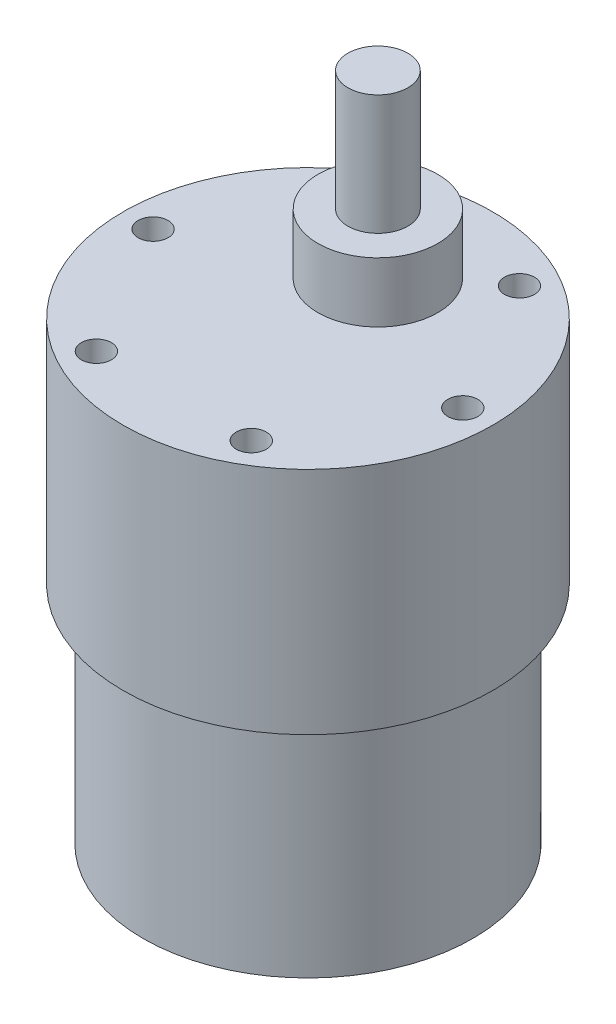
ISO-10303-21;
HEADER;
FILE_DESCRIPTION(('STEP AP214'),'2;1');
FILE_NAME('part.step','',(''),(''),'','','');
FILE_SCHEMA(('AUTOMOTIVE_DESIGN { 1 0 10303 214 1 1 1 1 }'));
ENDSEC;
DATA;
#1=APPLICATION_CONTEXT('core data for automotive mechanical design processes');
#2=APPLICATION_PROTOCOL_DEFINITION('international standard','automotive_design',2000,#1);
#3=PRODUCT_CONTEXT('',#1,'mechanical');
#4=PRODUCT('Part','Part','',(#3));
#5=PRODUCT_RELATED_PRODUCT_CATEGORY('part','',(#4));
#6=PRODUCT_DEFINITION_FORMATION('','',#4);
#7=PRODUCT_DEFINITION_CONTEXT('part definition',#1,'design');
#8=PRODUCT_DEFINITION('design','',#6,#7);
#9=PRODUCT_DEFINITION_SHAPE('','',#8);
#10=(LENGTH_UNIT() NAMED_UNIT(*) SI_UNIT(.MILLI.,.METRE.));
#11=(NAMED_UNIT(*) PLANE_ANGLE_UNIT() SI_UNIT($,.RADIAN.));
#12=(NAMED_UNIT(*) SI_UNIT($,.STERADIAN.) SOLID_ANGLE_UNIT());
#13=UNCERTAINTY_MEASURE_WITH_UNIT(LENGTH_MEASURE(1.E-05),#10,'distance_accuracy_value','');
#14=(GEOMETRIC_REPRESENTATION_CONTEXT(3) GLOBAL_UNCERTAINTY_ASSIGNED_CONTEXT((#13)) GLOBAL_UNIT_ASSIGNED_CONTEXT((#10,
#11,#12)) REPRESENTATION_CONTEXT('',''));
#15=CARTESIAN_POINT('',(0.,0.,0.));
#16=DIRECTION('',(0.,0.,1.));
#17=DIRECTION('',(1.,0.,0.));
#18=AXIS2_PLACEMENT_3D('',#15,#16,#17);
#19=CARTESIAN_POINT('',(0.,6.,-7.));
#20=DIRECTION('',(0.,1.,0.));
#21=DIRECTION('',(0.,0.,1.));
#22=AXIS2_PLACEMENT_3D('',#19,#20,#21);
#23=PLANE('',#22);
#24=CARTESIAN_POINT('',(0.,6.,-7.));
#25=DIRECTION('',(0.,1.,0.));
#26=DIRECTION('',(0.,0.,1.));
#27=AXIS2_PLACEMENT_3D('',#24,#25,#26);
#28=CIRCLE('',#27,6.);
#29=CARTESIAN_POINT('',(0.,6.,-0.999999999999999));
#30=VERTEX_POINT('',#29);
#31=EDGE_CURVE('E89',#30,#30,#28,.T.);
#32=ORIENTED_EDGE('',*,*,#31,.T.);
#33=EDGE_LOOP('',(#32));
#34=FACE_BOUND('',#33,.T.);
#35=CARTESIAN_POINT('',(0.,6.,-7.));
#36=DIRECTION('',(0.,1.,0.));
#37=DIRECTION('',(0.,0.,1.));
#38=AXIS2_PLACEMENT_3D('',#35,#36,#37);
#39=CIRCLE('',#38,3.);
#40=CARTESIAN_POINT('',(0.,6.,-4.));
#41=VERTEX_POINT('',#40);
#42=EDGE_CURVE('E98',#41,#41,#39,.T.);
#43=ORIENTED_EDGE('',*,*,#42,.F.);
#44=EDGE_LOOP('',(#43));
#45=FACE_BOUND('',#44,.T.);
#46=ADVANCED_FACE('F35',(#34,#45),#23,.T.);
#47=CARTESIAN_POINT('',(0.,0.,0.));
#48=DIRECTION('',(0.,1.,0.));
#49=DIRECTION('',(0.,0.,1.));
#50=AXIS2_PLACEMENT_3D('',#47,#48,#49);
#51=PLANE('',#50);
#52=CARTESIAN_POINT('',(0.,0.,0.));
#53=DIRECTION('',(0.,1.,0.));
#54=DIRECTION('',(0.,0.,1.));
#55=AXIS2_PLACEMENT_3D('',#52,#53,#54);
#56=CIRCLE('',#55,18.5);
#57=CARTESIAN_POINT('',(0.,0.,18.5));
#58=VERTEX_POINT('',#57);
#59=EDGE_CURVE('E46',#58,#58,#56,.T.);
#60=ORIENTED_EDGE('',*,*,#59,.T.);
#61=EDGE_LOOP('',(#60));
#62=FACE_BOUND('',#61,.T.);
#63=CARTESIAN_POINT('',(-15.5,0.,0.));
#64=DIRECTION('',(0.,1.,0.));
#65=DIRECTION('',(0.,0.,1.));
#66=AXIS2_PLACEMENT_3D('',#63,#64,#65);
#67=CIRCLE('',#66,1.5);
#68=CARTESIAN_POINT('',(-15.5,0.,1.5));
#69=VERTEX_POINT('',#68);
#70=EDGE_CURVE('E56',#69,#69,#67,.T.);
#71=ORIENTED_EDGE('',*,*,#70,.F.);
#72=EDGE_LOOP('',(#71));
#73=FACE_BOUND('',#72,.T.);
#74=CARTESIAN_POINT('',(-7.74999999999997,0.,-13.4233937586588));
#75=DIRECTION('',(0.,1.,0.));
#76=DIRECTION('',(0.,0.,1.));
#77=AXIS2_PLACEMENT_3D('',#74,#75,#76);
#78=CIRCLE('',#77,1.5);
#79=CARTESIAN_POINT('',(-7.74999999999997,0.,-11.9233937586588));
#80=VERTEX_POINT('',#79);
#81=EDGE_CURVE('E62',#80,#80,#78,.T.);
#82=ORIENTED_EDGE('',*,*,#81,.F.);
#83=EDGE_LOOP('',(#82));
#84=FACE_BOUND('',#83,.T.);
#85=CARTESIAN_POINT('',(7.75000000000006,0.,-13.4233937586588));
#86=DIRECTION('',(0.,1.,0.));
#87=DIRECTION('',(0.,0.,1.));
#88=AXIS2_PLACEMENT_3D('',#85,#86,#87);
#89=CIRCLE('',#88,1.5);
#90=CARTESIAN_POINT('',(7.75000000000006,0.,-11.9233937586588));
#91=VERTEX_POINT('',#90);
#92=EDGE_CURVE('E68',#91,#91,#89,.T.);
#93=ORIENTED_EDGE('',*,*,#92,.F.);
#94=EDGE_LOOP('',(#93));
#95=FACE_BOUND('',#94,.T.);
#96=CARTESIAN_POINT('',(15.5,0.,1.08235921504137E-13));
#97=DIRECTION('',(0.,1.,0.));
#98=DIRECTION('',(0.,0.,1.));
#99=AXIS2_PLACEMENT_3D('',#96,#97,#98);
#100=CIRCLE('',#99,1.5);
#101=CARTESIAN_POINT('',(15.5,0.,1.50000000000011));
#102=VERTEX_POINT('',#101);
#103=EDGE_CURVE('E74',#102,#102,#100,.T.);
#104=ORIENTED_EDGE('',*,*,#103,.F.);
#105=EDGE_LOOP('',(#104));
#106=FACE_BOUND('',#105,.T.);
#107=CARTESIAN_POINT('',(7.74999999999987,0.,13.4233937586589));
#108=DIRECTION('',(0.,1.,0.));
#109=DIRECTION('',(0.,0.,1.));
#110=AXIS2_PLACEMENT_3D('',#107,#108,#109);
#111=CIRCLE('',#110,1.5);
#112=CARTESIAN_POINT('',(7.74999999999987,0.,14.9233937586589));
#113=VERTEX_POINT('',#112);
#114=EDGE_CURVE('E80',#113,#113,#111,.T.);
#115=ORIENTED_EDGE('',*,*,#114,.F.);
#116=EDGE_LOOP('',(#115));
#117=FACE_BOUND('',#116,.T.);
#118=CARTESIAN_POINT('',(-7.75000000000016,0.,13.4233937586587));
#119=DIRECTION('',(0.,1.,0.));
#120=DIRECTION('',(0.,0.,1.));
#121=AXIS2_PLACEMENT_3D('',#118,#119,#120);
#122=CIRCLE('',#121,1.5);
#123=CARTESIAN_POINT('',(-7.75000000000016,0.,14.9233937586587));
#124=VERTEX_POINT('',#123);
#125=EDGE_CURVE('E86',#124,#124,#122,.T.);
#126=ORIENTED_EDGE('',*,*,#125,.F.);
#127=EDGE_LOOP('',(#126));
#128=FACE_BOUND('',#127,.T.);
#129=CARTESIAN_POINT('',(0.,0.,-7.));
#130=DIRECTION('',(0.,1.,0.));
#131=DIRECTION('',(0.,0.,1.));
#132=AXIS2_PLACEMENT_3D('',#129,#130,#131);
#133=CIRCLE('',#132,6.);
#134=CARTESIAN_POINT('',(0.,0.,-0.999999999999999));
#135=VERTEX_POINT('',#134);
#136=EDGE_CURVE('E92',#135,#135,#133,.T.);
#137=ORIENTED_EDGE('',*,*,#136,.F.);
#138=EDGE_LOOP('',(#137));
#139=FACE_BOUND('',#138,.T.);
#140=ADVANCED_FACE('F114',(#62,#73,#84,#95,#106,#117,#128,#139),#51,.T.);
#141=CARTESIAN_POINT('',(0.,-23.,0.));
#142=DIRECTION('',(0.,1.,0.));
#143=DIRECTION('',(0.,0.,1.));
#144=AXIS2_PLACEMENT_3D('',#141,#142,#143);
#145=PLANE('',#144);
#146=CARTESIAN_POINT('',(0.,-23.,0.));
#147=DIRECTION('',(0.,1.,0.));
#148=DIRECTION('',(0.,0.,1.));
#149=AXIS2_PLACEMENT_3D('',#146,#147,#148);
#150=CIRCLE('',#149,18.5);
#151=CARTESIAN_POINT('',(0.,-23.,18.5));
#152=VERTEX_POINT('',#151);
#153=EDGE_CURVE('E42',#152,#152,#150,.T.);
#154=ORIENTED_EDGE('',*,*,#153,.F.);
#155=EDGE_LOOP('',(#154));
#156=FACE_BOUND('',#155,.T.);
#157=CARTESIAN_POINT('',(0.,-23.,0.));
#158=DIRECTION('',(0.,1.,0.));
#159=DIRECTION('',(0.,0.,1.));
#160=AXIS2_PLACEMENT_3D('',#157,#158,#159);
#161=CIRCLE('',#160,16.5);
#162=CARTESIAN_POINT('',(0.,-23.,16.5));
#163=VERTEX_POINT('',#162);
#164=EDGE_CURVE('E10',#163,#163,#161,.F.);
#165=ORIENTED_EDGE('',*,*,#164,.F.);
#166=EDGE_LOOP('',(#165));
#167=FACE_BOUND('',#166,.T.);
#168=ADVANCED_FACE('F120',(#156,#167),#145,.F.);
#169=CARTESIAN_POINT('',(0.,-23.,0.));
#170=DIRECTION('',(0.,1.,0.));
#171=DIRECTION('',(0.,0.,1.));
#172=AXIS2_PLACEMENT_3D('',#169,#170,#171);
#173=CYLINDRICAL_SURFACE('',#172,18.5);
#174=ORIENTED_EDGE('',*,*,#153,.T.);
#175=EDGE_LOOP('',(#174));
#176=FACE_BOUND('',#175,.T.);
#177=ORIENTED_EDGE('',*,*,#59,.F.);
#178=EDGE_LOOP('',(#177));
#179=FACE_BOUND('',#178,.T.);
#180=ADVANCED_FACE('F37',(#176,#179),#173,.T.);
#181=CARTESIAN_POINT('',(0.,-45.5,0.));
#182=DIRECTION('',(0.,1.,0.));
#183=DIRECTION('',(0.,0.,1.));
#184=AXIS2_PLACEMENT_3D('',#181,#182,#183);
#185=CYLINDRICAL_SURFACE('',#184,16.5);
#186=CARTESIAN_POINT('',(0.,-45.5,0.));
#187=DIRECTION('',(0.,-1.,0.));
#188=DIRECTION('',(0.,0.,-1.));
#189=AXIS2_PLACEMENT_3D('',#186,#187,#188);
#190=CIRCLE('',#189,16.5);
#191=CARTESIAN_POINT('',(0.,-45.5,16.5));
#192=VERTEX_POINT('',#191);
#193=EDGE_CURVE('E51',#192,#192,#190,.T.);
#194=CARTESIAN_POINT('',(0.,-45.5,16.5));
#195=CARTESIAN_POINT('',(0.,-45.265625,16.5));
#196=CARTESIAN_POINT('',(0.,-45.03125,16.5));
#197=CARTESIAN_POINT('',(0.,-44.5625,16.5));
#198=CARTESIAN_POINT('',(0.,-44.328125,16.5));
#199=CARTESIAN_POINT('',(0.,-43.859375,16.5));
#200=CARTESIAN_POINT('',(0.,-43.625,16.5));
#201=CARTESIAN_POINT('',(0.,-43.15625,16.5));
#202=CARTESIAN_POINT('',(0.,-42.921875,16.5));
#203=CARTESIAN_POINT('',(0.,-42.453125,16.5));
#204=CARTESIAN_POINT('',(0.,-42.21875,16.5));
#205=CARTESIAN_POINT('',(0.,-41.75,16.5));
#206=CARTESIAN_POINT('',(0.,-41.515625,16.5));
#207=CARTESIAN_POINT('',(0.,-41.046875,16.5));
#208=CARTESIAN_POINT('',(0.,-40.8125,16.5));
#209=CARTESIAN_POINT('',(0.,-40.34375,16.5));
#210=CARTESIAN_POINT('',(0.,-40.109375,16.5));
#211=CARTESIAN_POINT('',(0.,-39.640625,16.5));
#212=CARTESIAN_POINT('',(0.,-39.40625,16.5));
#213=CARTESIAN_POINT('',(0.,-38.9375,16.5));
#214=CARTESIAN_POINT('',(0.,-38.703125,16.5));
#215=CARTESIAN_POINT('',(0.,-38.234375,16.5));
#216=CARTESIAN_POINT('',(0.,-38.,16.5));
#217=CARTESIAN_POINT('',(0.,-37.53125,16.5));
#218=CARTESIAN_POINT('',(0.,-37.296875,16.5));
#219=CARTESIAN_POINT('',(0.,-36.828125,16.5));
#220=CARTESIAN_POINT('',(0.,-36.59375,16.5));
#221=CARTESIAN_POINT('',(0.,-36.125,16.5));
#222=CARTESIAN_POINT('',(0.,-35.890625,16.5));
#223=CARTESIAN_POINT('',(0.,-35.421875,16.5));
#224=CARTESIAN_POINT('',(0.,-35.1875,16.5));
#225=CARTESIAN_POINT('',(0.,-34.71875,16.5));
#226=CARTESIAN_POINT('',(0.,-34.484375,16.5));
#227=CARTESIAN_POINT('',(0.,-34.015625,16.5));
#228=CARTESIAN_POINT('',(0.,-33.78125,16.5));
#229=CARTESIAN_POINT('',(0.,-33.3125,16.5));
#230=CARTESIAN_POINT('',(0.,-33.078125,16.5));
#231=CARTESIAN_POINT('',(0.,-32.609375,16.5));
#232=CARTESIAN_POINT('',(0.,-32.375,16.5));
#233=CARTESIAN_POINT('',(0.,-31.90625,16.5));
#234=CARTESIAN_POINT('',(0.,-31.671875,16.5));
#235=CARTESIAN_POINT('',(0.,-31.203125,16.5));
#236=CARTESIAN_POINT('',(0.,-30.96875,16.5));
#237=CARTESIAN_POINT('',(0.,-30.5,16.5));
#238=CARTESIAN_POINT('',(0.,-30.265625,16.5));
#239=CARTESIAN_POINT('',(0.,-29.796875,16.5));
#240=CARTESIAN_POINT('',(0.,-29.5625,16.5));
#241=CARTESIAN_POINT('',(0.,-29.09375,16.5));
#242=CARTESIAN_POINT('',(0.,-28.859375,16.5));
#243=CARTESIAN_POINT('',(0.,-28.390625,16.5));
#244=CARTESIAN_POINT('',(0.,-28.15625,16.5));
#245=CARTESIAN_POINT('',(0.,-27.6875,16.5));
#246=CARTESIAN_POINT('',(0.,-27.453125,16.5));
#247=CARTESIAN_POINT('',(0.,-26.984375,16.5));
#248=CARTESIAN_POINT('',(0.,-26.75,16.5));
#249=CARTESIAN_POINT('',(0.,-26.28125,16.5));
#250=CARTESIAN_POINT('',(0.,-26.046875,16.5));
#251=CARTESIAN_POINT('',(0.,-25.578125,16.5));
#252=CARTESIAN_POINT('',(0.,-25.34375,16.5));
#253=CARTESIAN_POINT('',(0.,-24.875,16.5));
#254=CARTESIAN_POINT('',(0.,-24.640625,16.5));
#255=CARTESIAN_POINT('',(0.,-24.171875,16.5));
#256=CARTESIAN_POINT('',(0.,-23.9375,16.5));
#257=CARTESIAN_POINT('',(0.,-23.46875,16.5));
#258=CARTESIAN_POINT('',(0.,-23.234375,16.5));
#259=CARTESIAN_POINT('',(0.,-23.,16.5));
#260=B_SPLINE_CURVE_WITH_KNOTS('',3,(#194,#195,#196,#197,#198,#199,#200,#201,#202,#203,#204,
#205,#206,#207,#208,#209,#210,#211,#212,#213,#214,#215,#216,#217,#218,#219,#220,#221,#222,#223,
#224,#225,#226,#227,#228,#229,#230,#231,#232,#233,#234,#235,#236,#237,#238,#239,#240,#241,#242,
#243,#244,#245,#246,#247,#248,#249,#250,#251,#252,#253,#254,#255,#256,#257,#258,#259),
.UNSPECIFIED.,.F.,.F.,(4,2,2,2,2,2,2,2,2,2,2,2,2,2,2,2,2,2,2,2,2,2,2,2,2,2,2,2,2,2,2,2,4),(0.,
0.703125000000006,1.40625,2.109375,2.8125,3.515625,4.21875,4.921875,5.62500000000001,6.328125,
7.03125,7.734375,8.4375,9.140625,9.84375,10.546875,11.25,11.953125,12.65625,13.359375,14.0625,
14.765625,15.46875,16.171875,16.875,17.578125,18.28125,18.984375,19.6875,20.390625,21.09375,
21.796875,22.5),.UNSPECIFIED.);
#261=EDGE_CURVE('BSEAM178',#192,#163,#260,.T.);
#262=ORIENTED_EDGE('',*,*,#193,.F.);
#263=ORIENTED_EDGE('',*,*,#164,.T.);
#264=ORIENTED_EDGE('',*,*,#261,.T.);
#265=ORIENTED_EDGE('',*,*,#261,.F.);
#266=EDGE_LOOP('',(#262,#264,#263,#265));
#267=FACE_BOUND('',#266,.T.);
#268=ADVANCED_FACE('F178',(#267),#185,.T.);
#269=CARTESIAN_POINT('',(0.,-45.5,0.));
#270=DIRECTION('',(0.,-1.,0.));
#271=DIRECTION('',(0.,0.,-1.));
#272=AXIS2_PLACEMENT_3D('',#269,#270,#271);
#273=PLANE('',#272);
#274=ORIENTED_EDGE('',*,*,#193,.T.);
#275=EDGE_LOOP('',(#274));
#276=FACE_BOUND('',#275,.T.);
#277=ADVANCED_FACE('F174',(#276),#273,.T.);
#278=CARTESIAN_POINT('',(-15.5,-10.,0.));
#279=DIRECTION('',(0.,1.,0.));
#280=DIRECTION('',(0.,0.,1.));
#281=AXIS2_PLACEMENT_3D('',#278,#279,#280);
#282=CYLINDRICAL_SURFACE('',#281,1.5);
#283=CARTESIAN_POINT('',(-15.5,-10.,0.));
#284=DIRECTION('',(0.,1.,0.));
#285=DIRECTION('',(0.,0.,1.));
#286=AXIS2_PLACEMENT_3D('',#283,#284,#285);
#287=CIRCLE('',#286,1.5);
#288=CARTESIAN_POINT('',(-15.5,-10.,1.5));
#289=VERTEX_POINT('',#288);
#290=EDGE_CURVE('E55',#289,#289,#287,.T.);
#291=ORIENTED_EDGE('',*,*,#290,.F.);
#292=EDGE_LOOP('',(#291));
#293=FACE_BOUND('',#292,.T.);
#294=ORIENTED_EDGE('',*,*,#70,.T.);
#295=EDGE_LOOP('',(#294));
#296=FACE_BOUND('',#295,.T.);
#297=ADVANCED_FACE('F170',(#293,#296),#282,.F.);
#298=CARTESIAN_POINT('',(-15.5,-10.,0.));
#299=DIRECTION('',(0.,1.,0.));
#300=DIRECTION('',(0.,0.,1.));
#301=AXIS2_PLACEMENT_3D('',#298,#299,#300);
#302=PLANE('',#301);
#303=ORIENTED_EDGE('',*,*,#290,.T.);
#304=EDGE_LOOP('',(#303));
#305=FACE_BOUND('',#304,.T.);
#306=ADVANCED_FACE('F166',(#305),#302,.T.);
#307=CARTESIAN_POINT('',(-7.74999999999997,-10.,-13.4233937586588));
#308=DIRECTION('',(0.,1.,0.));
#309=DIRECTION('',(0.,0.,1.));
#310=AXIS2_PLACEMENT_3D('',#307,#308,#309);
#311=CYLINDRICAL_SURFACE('',#310,1.5);
#312=CARTESIAN_POINT('',(-7.74999999999997,-10.,-13.4233937586588));
#313=DIRECTION('',(0.,1.,0.));
#314=DIRECTION('',(0.,0.,1.));
#315=AXIS2_PLACEMENT_3D('',#312,#313,#314);
#316=CIRCLE('',#315,1.5);
#317=CARTESIAN_POINT('',(-7.74999999999997,-10.,-11.9233937586588));
#318=VERTEX_POINT('',#317);
#319=EDGE_CURVE('E59',#318,#318,#316,.T.);
#320=ORIENTED_EDGE('',*,*,#319,.F.);
#321=EDGE_LOOP('',(#320));
#322=FACE_BOUND('',#321,.T.);
#323=ORIENTED_EDGE('',*,*,#81,.T.);
#324=EDGE_LOOP('',(#323));
#325=FACE_BOUND('',#324,.T.);
#326=ADVANCED_FACE('F162',(#322,#325),#311,.F.);
#327=CARTESIAN_POINT('',(-7.74999999999997,-10.,-13.4233937586588));
#328=DIRECTION('',(0.,1.,0.));
#329=DIRECTION('',(0.,0.,1.));
#330=AXIS2_PLACEMENT_3D('',#327,#328,#329);
#331=PLANE('',#330);
#332=ORIENTED_EDGE('',*,*,#319,.T.);
#333=EDGE_LOOP('',(#332));
#334=FACE_BOUND('',#333,.T.);
#335=ADVANCED_FACE('F158',(#334),#331,.T.);
#336=CARTESIAN_POINT('',(7.75000000000006,-10.,-13.4233937586588));
#337=DIRECTION('',(0.,1.,0.));
#338=DIRECTION('',(0.,0.,1.));
#339=AXIS2_PLACEMENT_3D('',#336,#337,#338);
#340=CYLINDRICAL_SURFACE('',#339,1.5);
#341=CARTESIAN_POINT('',(7.75000000000006,-10.,-13.4233937586588));
#342=DIRECTION('',(0.,1.,0.));
#343=DIRECTION('',(0.,0.,1.));
#344=AXIS2_PLACEMENT_3D('',#341,#342,#343);
#345=CIRCLE('',#344,1.5);
#346=CARTESIAN_POINT('',(7.75000000000006,-10.,-11.9233937586588));
#347=VERTEX_POINT('',#346);
#348=EDGE_CURVE('E65',#347,#347,#345,.T.);
#349=ORIENTED_EDGE('',*,*,#348,.F.);
#350=EDGE_LOOP('',(#349));
#351=FACE_BOUND('',#350,.T.);
#352=ORIENTED_EDGE('',*,*,#92,.T.);
#353=EDGE_LOOP('',(#352));
#354=FACE_BOUND('',#353,.T.);
#355=ADVANCED_FACE('F154',(#351,#354),#340,.F.);
#356=CARTESIAN_POINT('',(7.75000000000006,-10.,-13.4233937586588));
#357=DIRECTION('',(0.,1.,0.));
#358=DIRECTION('',(0.,0.,1.));
#359=AXIS2_PLACEMENT_3D('',#356,#357,#358);
#360=PLANE('',#359);
#361=ORIENTED_EDGE('',*,*,#348,.T.);
#362=EDGE_LOOP('',(#361));
#363=FACE_BOUND('',#362,.T.);
#364=ADVANCED_FACE('F150',(#363),#360,.T.);
#365=CARTESIAN_POINT('',(15.5,-10.,1.08235921504137E-13));
#366=DIRECTION('',(0.,1.,0.));
#367=DIRECTION('',(0.,0.,1.));
#368=AXIS2_PLACEMENT_3D('',#365,#366,#367);
#369=CYLINDRICAL_SURFACE('',#368,1.5);
#370=CARTESIAN_POINT('',(15.5,-10.,1.08235921504137E-13));
#371=DIRECTION('',(0.,1.,0.));
#372=DIRECTION('',(0.,0.,1.));
#373=AXIS2_PLACEMENT_3D('',#370,#371,#372);
#374=CIRCLE('',#373,1.5);
#375=CARTESIAN_POINT('',(15.5,-10.,1.50000000000011));
#376=VERTEX_POINT('',#375);
#377=EDGE_CURVE('E71',#376,#376,#374,.T.);
#378=ORIENTED_EDGE('',*,*,#377,.F.);
#379=EDGE_LOOP('',(#378));
#380=FACE_BOUND('',#379,.T.);
#381=ORIENTED_EDGE('',*,*,#103,.T.);
#382=EDGE_LOOP('',(#381));
#383=FACE_BOUND('',#382,.T.);
#384=ADVANCED_FACE('F146',(#380,#383),#369,.F.);
#385=CARTESIAN_POINT('',(15.5,-10.,1.08235921504137E-13));
#386=DIRECTION('',(0.,1.,0.));
#387=DIRECTION('',(0.,0.,1.));
#388=AXIS2_PLACEMENT_3D('',#385,#386,#387);
#389=PLANE('',#388);
#390=ORIENTED_EDGE('',*,*,#377,.T.);
#391=EDGE_LOOP('',(#390));
#392=FACE_BOUND('',#391,.T.);
#393=ADVANCED_FACE('F142',(#392),#389,.T.);
#394=CARTESIAN_POINT('',(7.74999999999987,-10.,13.4233937586589));
#395=DIRECTION('',(0.,1.,0.));
#396=DIRECTION('',(0.,0.,1.));
#397=AXIS2_PLACEMENT_3D('',#394,#395,#396);
#398=CYLINDRICAL_SURFACE('',#397,1.5);
#399=CARTESIAN_POINT('',(7.74999999999987,-10.,13.4233937586589));
#400=DIRECTION('',(0.,1.,0.));
#401=DIRECTION('',(0.,0.,1.));
#402=AXIS2_PLACEMENT_3D('',#399,#400,#401);
#403=CIRCLE('',#402,1.5);
#404=CARTESIAN_POINT('',(7.74999999999987,-10.,14.9233937586589));
#405=VERTEX_POINT('',#404);
#406=EDGE_CURVE('E77',#405,#405,#403,.T.);
#407=ORIENTED_EDGE('',*,*,#406,.F.);
#408=EDGE_LOOP('',(#407));
#409=FACE_BOUND('',#408,.T.);
#410=ORIENTED_EDGE('',*,*,#114,.T.);
#411=EDGE_LOOP('',(#410));
#412=FACE_BOUND('',#411,.T.);
#413=ADVANCED_FACE('F138',(#409,#412),#398,.F.);
#414=CARTESIAN_POINT('',(7.74999999999987,-10.,13.4233937586589));
#415=DIRECTION('',(0.,1.,0.));
#416=DIRECTION('',(0.,0.,1.));
#417=AXIS2_PLACEMENT_3D('',#414,#415,#416);
#418=PLANE('',#417);
#419=ORIENTED_EDGE('',*,*,#406,.T.);
#420=EDGE_LOOP('',(#419));
#421=FACE_BOUND('',#420,.T.);
#422=ADVANCED_FACE('F134',(#421),#418,.T.);
#423=CARTESIAN_POINT('',(-7.75000000000016,-10.,13.4233937586587));
#424=DIRECTION('',(0.,1.,0.));
#425=DIRECTION('',(0.,0.,1.));
#426=AXIS2_PLACEMENT_3D('',#423,#424,#425);
#427=CYLINDRICAL_SURFACE('',#426,1.5);
#428=CARTESIAN_POINT('',(-7.75000000000016,-10.,13.4233937586587));
#429=DIRECTION('',(0.,1.,0.));
#430=DIRECTION('',(0.,0.,1.));
#431=AXIS2_PLACEMENT_3D('',#428,#429,#430);
#432=CIRCLE('',#431,1.5);
#433=CARTESIAN_POINT('',(-7.75000000000016,-10.,14.9233937586587));
#434=VERTEX_POINT('',#433);
#435=EDGE_CURVE('E83',#434,#434,#432,.T.);
#436=ORIENTED_EDGE('',*,*,#435,.F.);
#437=EDGE_LOOP('',(#436));
#438=FACE_BOUND('',#437,.T.);
#439=ORIENTED_EDGE('',*,*,#125,.T.);
#440=EDGE_LOOP('',(#439));
#441=FACE_BOUND('',#440,.T.);
#442=ADVANCED_FACE('F130',(#438,#441),#427,.F.);
#443=CARTESIAN_POINT('',(-7.75000000000016,-10.,13.4233937586587));
#444=DIRECTION('',(0.,1.,0.));
#445=DIRECTION('',(0.,0.,1.));
#446=AXIS2_PLACEMENT_3D('',#443,#444,#445);
#447=PLANE('',#446);
#448=ORIENTED_EDGE('',*,*,#435,.T.);
#449=EDGE_LOOP('',(#448));
#450=FACE_BOUND('',#449,.T.);
#451=ADVANCED_FACE('F126',(#450),#447,.T.);
#452=CARTESIAN_POINT('',(0.,6.,-7.));
#453=DIRECTION('',(0.,-1.,0.));
#454=DIRECTION('',(0.,0.,-1.));
#455=AXIS2_PLACEMENT_3D('',#452,#453,#454);
#456=CYLINDRICAL_SURFACE('',#455,6.);
#457=ORIENTED_EDGE('',*,*,#31,.F.);
#458=EDGE_LOOP('',(#457));
#459=FACE_BOUND('',#458,.T.);
#460=ORIENTED_EDGE('',*,*,#136,.T.);
#461=EDGE_LOOP('',(#460));
#462=FACE_BOUND('',#461,.T.);
#463=ADVANCED_FACE('F109',(#459,#462),#456,.T.);
#464=CARTESIAN_POINT('',(0.,18.,-7.));
#465=DIRECTION('',(0.,-1.,0.));
#466=DIRECTION('',(0.,0.,-1.));
#467=AXIS2_PLACEMENT_3D('',#464,#465,#466);
#468=CYLINDRICAL_SURFACE('',#467,3.);
#469=CARTESIAN_POINT('',(0.,18.,-7.));
#470=DIRECTION('',(0.,1.,0.));
#471=DIRECTION('',(0.,0.,1.));
#472=AXIS2_PLACEMENT_3D('',#469,#470,#471);
#473=CIRCLE('',#472,3.);
#474=CARTESIAN_POINT('',(0.,18.,-4.));
#475=VERTEX_POINT('',#474);
#476=EDGE_CURVE('E95',#475,#475,#473,.T.);
#477=ORIENTED_EDGE('',*,*,#476,.F.);
#478=EDGE_LOOP('',(#477));
#479=FACE_BOUND('',#478,.T.);
#480=ORIENTED_EDGE('',*,*,#42,.T.);
#481=EDGE_LOOP('',(#480));
#482=FACE_BOUND('',#481,.T.);
#483=ADVANCED_FACE('F106',(#479,#482),#468,.T.);
#484=CARTESIAN_POINT('',(0.,18.,-7.));
#485=DIRECTION('',(0.,1.,0.));
#486=DIRECTION('',(0.,0.,1.));
#487=AXIS2_PLACEMENT_3D('',#484,#485,#486);
#488=PLANE('',#487);
#489=ORIENTED_EDGE('',*,*,#476,.T.);
#490=EDGE_LOOP('',(#489));
#491=FACE_BOUND('',#490,.T.);
#492=ADVANCED_FACE('F104',(#491),#488,.T.);
#493=CLOSED_SHELL('',(#46,#140,#168,#180,#268,#277,#297,#306,#326,#335,#355,#364,#384,#393,#413,
#422,#442,#451,#463,#483,#492));
#494=MANIFOLD_SOLID_BREP('B2',#493);
#495=ADVANCED_BREP_SHAPE_REPRESENTATION('',(#18,#494),#14);
#496=SHAPE_DEFINITION_REPRESENTATION(#9,#495);
ENDSEC;
END-ISO-10303-21;
